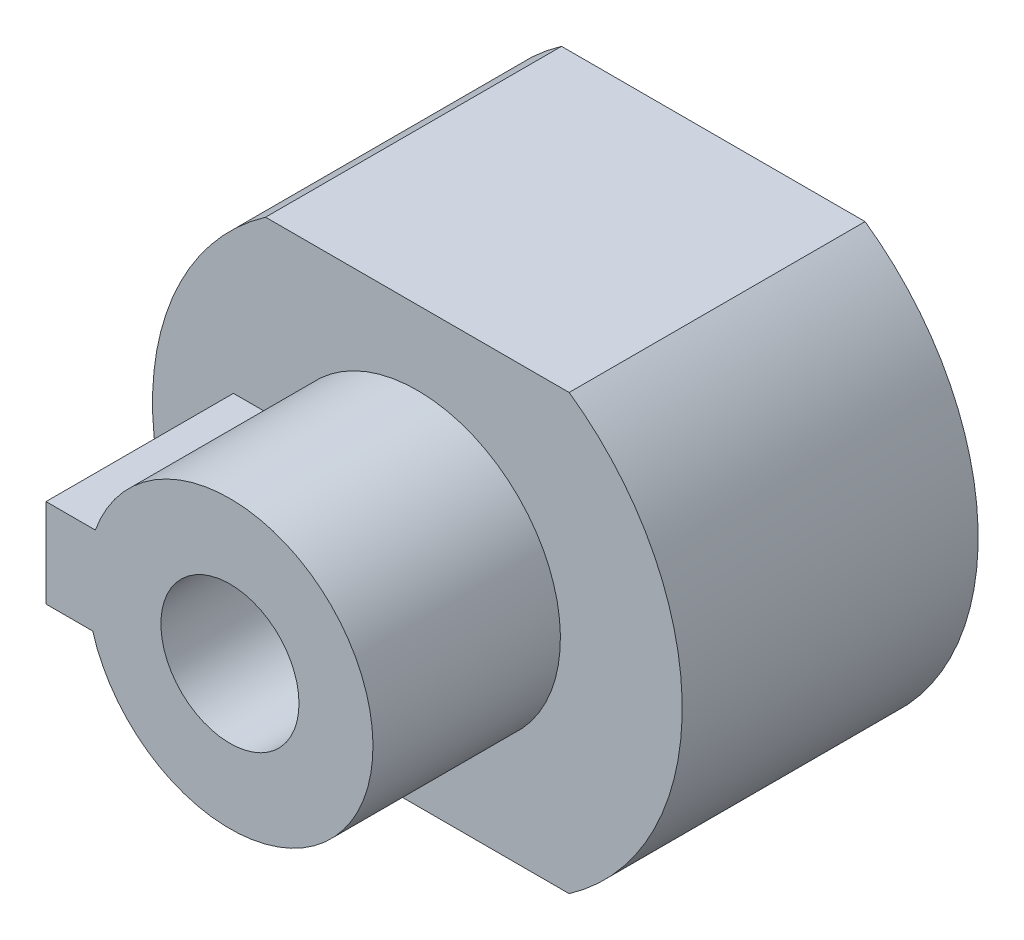
ISO-10303-21;
HEADER;
FILE_DESCRIPTION(('STEP AP214'),'2;1');
FILE_NAME('part.step','',(''),(''),'','','');
FILE_SCHEMA(('AUTOMOTIVE_DESIGN { 1 0 10303 214 1 1 1 1 }'));
ENDSEC;
DATA;
#1=APPLICATION_CONTEXT('core data for automotive mechanical design processes');
#2=APPLICATION_PROTOCOL_DEFINITION('international standard','automotive_design',2000,#1);
#3=PRODUCT_CONTEXT('',#1,'mechanical');
#4=PRODUCT('Part','Part','',(#3));
#5=PRODUCT_RELATED_PRODUCT_CATEGORY('part','',(#4));
#6=PRODUCT_DEFINITION_FORMATION('','',#4);
#7=PRODUCT_DEFINITION_CONTEXT('part definition',#1,'design');
#8=PRODUCT_DEFINITION('design','',#6,#7);
#9=PRODUCT_DEFINITION_SHAPE('','',#8);
#10=(LENGTH_UNIT() NAMED_UNIT(*) SI_UNIT(.MILLI.,.METRE.));
#11=(NAMED_UNIT(*) PLANE_ANGLE_UNIT() SI_UNIT($,.RADIAN.));
#12=(NAMED_UNIT(*) SI_UNIT($,.STERADIAN.) SOLID_ANGLE_UNIT());
#13=UNCERTAINTY_MEASURE_WITH_UNIT(LENGTH_MEASURE(1.E-05),#10,'distance_accuracy_value','');
#14=(GEOMETRIC_REPRESENTATION_CONTEXT(3) GLOBAL_UNCERTAINTY_ASSIGNED_CONTEXT((#13)) GLOBAL_UNIT_ASSIGNED_CONTEXT((#10,
#11,#12)) REPRESENTATION_CONTEXT('',''));
#15=CARTESIAN_POINT('',(0.,0.,0.));
#16=DIRECTION('',(0.,0.,1.));
#17=DIRECTION('',(1.,0.,0.));
#18=AXIS2_PLACEMENT_3D('',#15,#16,#17);
#19=CARTESIAN_POINT('',(0.,0.,6.));
#20=DIRECTION('',(0.,0.,1.));
#21=DIRECTION('',(1.,0.,0.));
#22=AXIS2_PLACEMENT_3D('',#19,#20,#21);
#23=PLANE('',#22);
#24=DIRECTION('',(-1.,0.,0.));
#25=VECTOR('',#24,1.);
#26=CARTESIAN_POINT('',(0.,-4.4,6.));
#27=LINE('',#26,#25);
#28=CARTESIAN_POINT('',(3.07711987667097,-4.4,6.));
#29=VERTEX_POINT('',#28);
#30=CARTESIAN_POINT('',(-3.07711987667097,-4.4,6.));
#31=VERTEX_POINT('',#30);
#32=EDGE_CURVE('E137',#29,#31,#27,.T.);
#33=ORIENTED_EDGE('',*,*,#32,.F.);
#34=CARTESIAN_POINT('',(0.,0.,6.));
#35=DIRECTION('',(0.,0.,1.));
#36=DIRECTION('',(1.,0.,0.));
#37=AXIS2_PLACEMENT_3D('',#34,#35,#36);
#38=CIRCLE('',#37,5.36923334708071);
#39=CARTESIAN_POINT('',(3.07711987667097,4.4,6.));
#40=VERTEX_POINT('',#39);
#41=EDGE_CURVE('E132',#29,#40,#38,.T.);
#42=ORIENTED_EDGE('',*,*,#41,.T.);
#43=DIRECTION('',(-1.,0.,0.));
#44=VECTOR('',#43,1.);
#45=CARTESIAN_POINT('',(0.,4.4,6.));
#46=LINE('',#45,#44);
#47=CARTESIAN_POINT('',(-3.07711987667097,4.4,6.));
#48=VERTEX_POINT('',#47);
#49=EDGE_CURVE('E121',#40,#48,#46,.T.);
#50=ORIENTED_EDGE('',*,*,#49,.T.);
#51=CARTESIAN_POINT('',(0.,0.,6.));
#52=DIRECTION('',(0.,0.,1.));
#53=DIRECTION('',(1.,0.,0.));
#54=AXIS2_PLACEMENT_3D('',#51,#52,#53);
#55=CIRCLE('',#54,5.36923334708071);
#56=EDGE_CURVE('E131',#31,#48,#55,.F.);
#57=ORIENTED_EDGE('',*,*,#56,.F.);
#58=EDGE_LOOP('',(#33,#42,#50,#57));
#59=FACE_BOUND('',#58,.T.);
#60=DIRECTION('',(-1.,0.,0.));
#61=VECTOR('',#60,1.);
#62=CARTESIAN_POINT('',(-3.72887210727574,0.981456581888599,6.));
#63=LINE('',#62,#61);
#64=CARTESIAN_POINT('',(-2.72887210727574,0.981456581888599,6.));
#65=VERTEX_POINT('',#64);
#66=CARTESIAN_POINT('',(-3.72887210727574,0.981456581888599,6.));
#67=VERTEX_POINT('',#66);
#68=EDGE_CURVE('E233',#65,#67,#63,.T.);
#69=ORIENTED_EDGE('',*,*,#68,.F.);
#70=CARTESIAN_POINT('',(0.,0.,6.));
#71=DIRECTION('',(0.,0.,1.));
#72=DIRECTION('',(1.,0.,0.));
#73=AXIS2_PLACEMENT_3D('',#70,#71,#72);
#74=CIRCLE('',#73,2.9);
#75=CARTESIAN_POINT('',(-2.78208315344213,-0.818543418111403,6.));
#76=VERTEX_POINT('',#75);
#77=EDGE_CURVE('E237',#76,#65,#74,.T.);
#78=ORIENTED_EDGE('',*,*,#77,.F.);
#79=DIRECTION('',(1.,0.,0.));
#80=VECTOR('',#79,1.);
#81=CARTESIAN_POINT('',(-3.72887210727574,-0.818543418111403,6.));
#82=LINE('',#81,#80);
#83=CARTESIAN_POINT('',(-3.72887210727574,-0.818543418111403,6.));
#84=VERTEX_POINT('',#83);
#85=EDGE_CURVE('E226',#84,#76,#82,.T.);
#86=ORIENTED_EDGE('',*,*,#85,.F.);
#87=DIRECTION('',(0.,-1.,0.));
#88=VECTOR('',#87,1.);
#89=CARTESIAN_POINT('',(-3.72887210727574,-0.818543418111403,6.));
#90=LINE('',#89,#88);
#91=EDGE_CURVE('E230',#67,#84,#90,.T.);
#92=ORIENTED_EDGE('',*,*,#91,.F.);
#93=EDGE_LOOP('',(#69,#78,#86,#92));
#94=FACE_BOUND('',#93,.T.);
#95=ADVANCED_FACE('F45',(#59,#94),#23,.T.);
#96=CARTESIAN_POINT('',(0.,-4.4,6.));
#97=DIRECTION('',(0.,-1.,0.));
#98=DIRECTION('',(0.,0.,-1.));
#99=AXIS2_PLACEMENT_3D('',#96,#97,#98);
#100=PLANE('',#99);
#101=DIRECTION('',(-1.,0.,0.));
#102=VECTOR('',#101,1.);
#103=CARTESIAN_POINT('',(0.,-4.4,0.));
#104=LINE('',#103,#102);
#105=CARTESIAN_POINT('',(3.07711987667097,-4.4,0.));
#106=VERTEX_POINT('',#105);
#107=CARTESIAN_POINT('',(-3.07711987667097,-4.4,0.));
#108=VERTEX_POINT('',#107);
#109=EDGE_CURVE('E177',#106,#108,#104,.T.);
#110=ORIENTED_EDGE('',*,*,#109,.F.);
#111=DIRECTION('',(0.,0.,-1.));
#112=VECTOR('',#111,1.);
#113=CARTESIAN_POINT('',(3.07711987667097,-4.4,6.));
#114=LINE('',#113,#112);
#115=EDGE_CURVE('E11',#29,#106,#114,.T.);
#116=ORIENTED_EDGE('',*,*,#115,.F.);
#117=ORIENTED_EDGE('',*,*,#32,.T.);
#118=DIRECTION('',(0.,0.,-1.));
#119=VECTOR('',#118,1.);
#120=CARTESIAN_POINT('',(-3.07711987667097,-4.4,6.));
#121=LINE('',#120,#119);
#122=EDGE_CURVE('E72',#31,#108,#121,.T.);
#123=ORIENTED_EDGE('',*,*,#122,.T.);
#124=EDGE_LOOP('',(#110,#116,#117,#123));
#125=FACE_BOUND('',#124,.T.);
#126=ADVANCED_FACE('F276',(#125),#100,.T.);
#127=CARTESIAN_POINT('',(0.,0.,6.));
#128=DIRECTION('',(0.,0.,-1.));
#129=DIRECTION('',(-1.,0.,0.));
#130=AXIS2_PLACEMENT_3D('',#127,#128,#129);
#131=CYLINDRICAL_SURFACE('',#130,5.36923334708071);
#132=CARTESIAN_POINT('',(0.,0.,0.));
#133=DIRECTION('',(0.,0.,1.));
#134=DIRECTION('',(1.,0.,0.));
#135=AXIS2_PLACEMENT_3D('',#132,#133,#134);
#136=CIRCLE('',#135,5.36923334708071);
#137=CARTESIAN_POINT('',(3.07711987667097,4.4,0.));
#138=VERTEX_POINT('',#137);
#139=EDGE_CURVE('E143',#106,#138,#136,.T.);
#140=ORIENTED_EDGE('',*,*,#139,.T.);
#141=DIRECTION('',(0.,0.,-1.));
#142=VECTOR('',#141,1.);
#143=CARTESIAN_POINT('',(3.07711987667097,4.4,6.));
#144=LINE('',#143,#142);
#145=EDGE_CURVE('E55',#40,#138,#144,.T.);
#146=ORIENTED_EDGE('',*,*,#145,.F.);
#147=ORIENTED_EDGE('',*,*,#41,.F.);
#148=ORIENTED_EDGE('',*,*,#115,.T.);
#149=EDGE_LOOP('',(#140,#146,#147,#148));
#150=FACE_BOUND('',#149,.T.);
#151=ADVANCED_FACE('F141',(#150),#131,.T.);
#152=CARTESIAN_POINT('',(0.,4.4,6.));
#153=DIRECTION('',(0.,-1.,0.));
#154=DIRECTION('',(0.,0.,-1.));
#155=AXIS2_PLACEMENT_3D('',#152,#153,#154);
#156=PLANE('',#155);
#157=DIRECTION('',(-1.,0.,0.));
#158=VECTOR('',#157,1.);
#159=CARTESIAN_POINT('',(0.,4.4,0.));
#160=LINE('',#159,#158);
#161=CARTESIAN_POINT('',(-3.07711987667097,4.4,0.));
#162=VERTEX_POINT('',#161);
#163=EDGE_CURVE('E172',#138,#162,#160,.T.);
#164=ORIENTED_EDGE('',*,*,#163,.T.);
#165=DIRECTION('',(0.,0.,-1.));
#166=VECTOR('',#165,1.);
#167=CARTESIAN_POINT('',(-3.07711987667097,4.4,6.));
#168=LINE('',#167,#166);
#169=EDGE_CURVE('E127',#48,#162,#168,.T.);
#170=ORIENTED_EDGE('',*,*,#169,.F.);
#171=ORIENTED_EDGE('',*,*,#49,.F.);
#172=ORIENTED_EDGE('',*,*,#145,.T.);
#173=EDGE_LOOP('',(#164,#170,#171,#172));
#174=FACE_BOUND('',#173,.T.);
#175=ADVANCED_FACE('F124',(#174),#156,.F.);
#176=CARTESIAN_POINT('',(0.,0.,6.));
#177=DIRECTION('',(0.,0.,-1.));
#178=DIRECTION('',(-1.,0.,0.));
#179=AXIS2_PLACEMENT_3D('',#176,#177,#178);
#180=CYLINDRICAL_SURFACE('',#179,2.86923334708071);
#181=CARTESIAN_POINT('',(0.,0.,0.));
#182=DIRECTION('',(0.,0.,1.));
#183=DIRECTION('',(1.,0.,0.));
#184=AXIS2_PLACEMENT_3D('',#181,#182,#183);
#185=CIRCLE('',#184,2.86923334708071);
#186=CARTESIAN_POINT('',(2.15,-1.9,0.));
#187=VERTEX_POINT('',#186);
#188=CARTESIAN_POINT('',(2.15,1.9,0.));
#189=VERTEX_POINT('',#188);
#190=EDGE_CURVE('E191',#187,#189,#185,.T.);
#191=ORIENTED_EDGE('',*,*,#190,.F.);
#192=DIRECTION('',(0.,0.,-1.));
#193=VECTOR('',#192,1.);
#194=CARTESIAN_POINT('',(2.15,-1.9,6.));
#195=LINE('',#194,#193);
#196=CARTESIAN_POINT('',(2.15,-1.9,6.));
#197=VERTEX_POINT('',#196);
#198=EDGE_CURVE('E159',#197,#187,#195,.T.);
#199=ORIENTED_EDGE('',*,*,#198,.F.);
#200=CARTESIAN_POINT('',(0.,0.,6.));
#201=DIRECTION('',(0.,0.,1.));
#202=DIRECTION('',(1.,0.,0.));
#203=AXIS2_PLACEMENT_3D('',#200,#201,#202);
#204=CIRCLE('',#203,2.86923334708071);
#205=CARTESIAN_POINT('',(2.15,1.9,6.));
#206=VERTEX_POINT('',#205);
#207=EDGE_CURVE('E171',#197,#206,#204,.T.);
#208=ORIENTED_EDGE('',*,*,#207,.T.);
#209=DIRECTION('',(0.,0.,-1.));
#210=VECTOR('',#209,1.);
#211=CARTESIAN_POINT('',(2.15,1.9,6.));
#212=LINE('',#211,#210);
#213=EDGE_CURVE('E150',#206,#189,#212,.T.);
#214=ORIENTED_EDGE('',*,*,#213,.T.);
#215=EDGE_LOOP('',(#191,#199,#208,#214));
#216=FACE_BOUND('',#215,.T.);
#217=ADVANCED_FACE('F47',(#216),#180,.F.);
#218=CARTESIAN_POINT('',(0.,-1.9,6.));
#219=DIRECTION('',(0.,-1.,0.));
#220=DIRECTION('',(0.,0.,-1.));
#221=AXIS2_PLACEMENT_3D('',#218,#219,#220);
#222=PLANE('',#221);
#223=DIRECTION('',(-1.,0.,0.));
#224=VECTOR('',#223,1.);
#225=CARTESIAN_POINT('',(0.,-1.9,0.));
#226=LINE('',#225,#224);
#227=CARTESIAN_POINT('',(-2.15,-1.9,0.));
#228=VERTEX_POINT('',#227);
#229=EDGE_CURVE('E188',#187,#228,#226,.T.);
#230=ORIENTED_EDGE('',*,*,#229,.T.);
#231=DIRECTION('',(0.,0.,-1.));
#232=VECTOR('',#231,1.);
#233=CARTESIAN_POINT('',(-2.15,-1.9,6.));
#234=LINE('',#233,#232);
#235=CARTESIAN_POINT('',(-2.15,-1.9,6.));
#236=VERTEX_POINT('',#235);
#237=EDGE_CURVE('E156',#236,#228,#234,.T.);
#238=ORIENTED_EDGE('',*,*,#237,.F.);
#239=DIRECTION('',(-1.,0.,0.));
#240=VECTOR('',#239,1.);
#241=CARTESIAN_POINT('',(0.,-1.9,6.));
#242=LINE('',#241,#240);
#243=EDGE_CURVE('E206',#197,#236,#242,.T.);
#244=ORIENTED_EDGE('',*,*,#243,.F.);
#245=ORIENTED_EDGE('',*,*,#198,.T.);
#246=EDGE_LOOP('',(#230,#238,#244,#245));
#247=FACE_BOUND('',#246,.T.);
#248=ADVANCED_FACE('F304',(#247),#222,.F.);
#249=CARTESIAN_POINT('',(0.,0.,6.));
#250=DIRECTION('',(0.,0.,-1.));
#251=DIRECTION('',(-1.,0.,0.));
#252=AXIS2_PLACEMENT_3D('',#249,#250,#251);
#253=CYLINDRICAL_SURFACE('',#252,2.86923334708071);
#254=CARTESIAN_POINT('',(0.,0.,0.));
#255=DIRECTION('',(0.,0.,1.));
#256=DIRECTION('',(1.,0.,0.));
#257=AXIS2_PLACEMENT_3D('',#254,#255,#256);
#258=CIRCLE('',#257,2.86923334708071);
#259=CARTESIAN_POINT('',(-2.15,1.9,0.));
#260=VERTEX_POINT('',#259);
#261=EDGE_CURVE('E184',#228,#260,#258,.F.);
#262=ORIENTED_EDGE('',*,*,#261,.T.);
#263=DIRECTION('',(0.,0.,-1.));
#264=VECTOR('',#263,1.);
#265=CARTESIAN_POINT('',(-2.15,1.9,6.));
#266=LINE('',#265,#264);
#267=CARTESIAN_POINT('',(-2.15,1.9,6.));
#268=VERTEX_POINT('',#267);
#269=EDGE_CURVE('E153',#268,#260,#266,.T.);
#270=ORIENTED_EDGE('',*,*,#269,.F.);
#271=CARTESIAN_POINT('',(0.,0.,6.));
#272=DIRECTION('',(0.,0.,1.));
#273=DIRECTION('',(1.,0.,0.));
#274=AXIS2_PLACEMENT_3D('',#271,#272,#273);
#275=CIRCLE('',#274,2.86923334708071);
#276=EDGE_CURVE('E111',#236,#268,#275,.F.);
#277=ORIENTED_EDGE('',*,*,#276,.F.);
#278=ORIENTED_EDGE('',*,*,#237,.T.);
#279=EDGE_LOOP('',(#262,#270,#277,#278));
#280=FACE_BOUND('',#279,.T.);
#281=ADVANCED_FACE('F301',(#280),#253,.F.);
#282=CARTESIAN_POINT('',(0.,1.9,6.));
#283=DIRECTION('',(0.,-1.,0.));
#284=DIRECTION('',(0.,0.,-1.));
#285=AXIS2_PLACEMENT_3D('',#282,#283,#284);
#286=PLANE('',#285);
#287=DIRECTION('',(-1.,0.,0.));
#288=VECTOR('',#287,1.);
#289=CARTESIAN_POINT('',(0.,1.9,0.));
#290=LINE('',#289,#288);
#291=EDGE_CURVE('E180',#189,#260,#290,.T.);
#292=ORIENTED_EDGE('',*,*,#291,.F.);
#293=ORIENTED_EDGE('',*,*,#213,.F.);
#294=DIRECTION('',(-1.,0.,0.));
#295=VECTOR('',#294,1.);
#296=CARTESIAN_POINT('',(0.,1.9,6.));
#297=LINE('',#296,#295);
#298=EDGE_CURVE('E200',#206,#268,#297,.T.);
#299=ORIENTED_EDGE('',*,*,#298,.T.);
#300=ORIENTED_EDGE('',*,*,#269,.T.);
#301=EDGE_LOOP('',(#292,#293,#299,#300));
#302=FACE_BOUND('',#301,.T.);
#303=ADVANCED_FACE('F294',(#302),#286,.T.);
#304=CARTESIAN_POINT('',(0.,0.,6.));
#305=DIRECTION('',(0.,0.,-1.));
#306=DIRECTION('',(-1.,0.,0.));
#307=AXIS2_PLACEMENT_3D('',#304,#305,#306);
#308=CYLINDRICAL_SURFACE('',#307,5.36923334708071);
#309=CARTESIAN_POINT('',(0.,0.,0.));
#310=DIRECTION('',(0.,0.,1.));
#311=DIRECTION('',(1.,0.,0.));
#312=AXIS2_PLACEMENT_3D('',#309,#310,#311);
#313=CIRCLE('',#312,5.36923334708071);
#314=EDGE_CURVE('E167',#108,#162,#313,.F.);
#315=ORIENTED_EDGE('',*,*,#314,.F.);
#316=ORIENTED_EDGE('',*,*,#122,.F.);
#317=ORIENTED_EDGE('',*,*,#56,.T.);
#318=ORIENTED_EDGE('',*,*,#169,.T.);
#319=EDGE_LOOP('',(#315,#316,#317,#318));
#320=FACE_BOUND('',#319,.T.);
#321=ADVANCED_FACE('F290',(#320),#308,.T.);
#322=CARTESIAN_POINT('',(0.,0.,0.));
#323=DIRECTION('',(0.,0.,1.));
#324=DIRECTION('',(1.,0.,0.));
#325=AXIS2_PLACEMENT_3D('',#322,#323,#324);
#326=PLANE('',#325);
#327=ORIENTED_EDGE('',*,*,#190,.T.);
#328=ORIENTED_EDGE('',*,*,#291,.T.);
#329=ORIENTED_EDGE('',*,*,#261,.F.);
#330=ORIENTED_EDGE('',*,*,#229,.F.);
#331=EDGE_LOOP('',(#327,#328,#329,#330));
#332=FACE_BOUND('',#331,.T.);
#333=ORIENTED_EDGE('',*,*,#109,.T.);
#334=ORIENTED_EDGE('',*,*,#314,.T.);
#335=ORIENTED_EDGE('',*,*,#163,.F.);
#336=ORIENTED_EDGE('',*,*,#139,.F.);
#337=EDGE_LOOP('',(#333,#334,#335,#336));
#338=FACE_BOUND('',#337,.T.);
#339=ADVANCED_FACE('F287',(#332,#338),#326,.F.);
#340=CARTESIAN_POINT('',(0.,0.,9.8));
#341=DIRECTION('',(0.,0.,1.));
#342=DIRECTION('',(1.,0.,0.));
#343=AXIS2_PLACEMENT_3D('',#340,#341,#342);
#344=PLANE('',#343);
#345=CARTESIAN_POINT('',(0.,0.,9.8));
#346=DIRECTION('',(0.,0.,1.));
#347=DIRECTION('',(1.,0.,0.));
#348=AXIS2_PLACEMENT_3D('',#345,#346,#347);
#349=CIRCLE('',#348,1.4);
#350=CARTESIAN_POINT('',(1.4,0.,9.8));
#351=VERTEX_POINT('',#350);
#352=EDGE_CURVE('E255',#351,#351,#349,.T.);
#353=ORIENTED_EDGE('',*,*,#352,.F.);
#354=EDGE_LOOP('',(#353));
#355=FACE_BOUND('',#354,.T.);
#356=CARTESIAN_POINT('',(0.,0.,9.8));
#357=DIRECTION('',(0.,0.,1.));
#358=DIRECTION('',(1.,0.,0.));
#359=AXIS2_PLACEMENT_3D('',#356,#357,#358);
#360=CIRCLE('',#359,2.9);
#361=CARTESIAN_POINT('',(-2.78208315344213,-0.818543418111403,9.8));
#362=VERTEX_POINT('',#361);
#363=CARTESIAN_POINT('',(-2.72887210727574,0.981456581888599,9.8));
#364=VERTEX_POINT('',#363);
#365=EDGE_CURVE('E229',#362,#364,#360,.T.);
#366=ORIENTED_EDGE('',*,*,#365,.T.);
#367=DIRECTION('',(-1.,0.,0.));
#368=VECTOR('',#367,1.);
#369=CARTESIAN_POINT('',(-3.72887210727574,0.981456581888599,9.8));
#370=LINE('',#369,#368);
#371=CARTESIAN_POINT('',(-3.72887210727574,0.981456581888599,9.8));
#372=VERTEX_POINT('',#371);
#373=EDGE_CURVE('E248',#364,#372,#370,.T.);
#374=ORIENTED_EDGE('',*,*,#373,.T.);
#375=DIRECTION('',(0.,-1.,0.));
#376=VECTOR('',#375,1.);
#377=CARTESIAN_POINT('',(-3.72887210727574,-0.818543418111403,9.8));
#378=LINE('',#377,#376);
#379=CARTESIAN_POINT('',(-3.72887210727574,-0.818543418111403,9.8));
#380=VERTEX_POINT('',#379);
#381=EDGE_CURVE('E244',#372,#380,#378,.T.);
#382=ORIENTED_EDGE('',*,*,#381,.T.);
#383=DIRECTION('',(1.,0.,0.));
#384=VECTOR('',#383,1.);
#385=CARTESIAN_POINT('',(-3.72887210727574,-0.818543418111403,9.8));
#386=LINE('',#385,#384);
#387=EDGE_CURVE('E225',#380,#362,#386,.T.);
#388=ORIENTED_EDGE('',*,*,#387,.T.);
#389=EDGE_LOOP('',(#366,#374,#382,#388));
#390=FACE_BOUND('',#389,.T.);
#391=ADVANCED_FACE('F289',(#355,#390),#344,.T.);
#392=CARTESIAN_POINT('',(-3.72887210727574,-0.818543418111403,9.8));
#393=DIRECTION('',(0.,1.,0.));
#394=DIRECTION('',(-1.,0.,0.));
#395=AXIS2_PLACEMENT_3D('',#392,#393,#394);
#396=PLANE('',#395);
#397=ORIENTED_EDGE('',*,*,#85,.T.);
#398=DIRECTION('',(0.,0.,-1.));
#399=VECTOR('',#398,1.);
#400=CARTESIAN_POINT('',(-2.78208315344213,-0.818543418111403,9.8));
#401=LINE('',#400,#399);
#402=EDGE_CURVE('E221',#362,#76,#401,.T.);
#403=ORIENTED_EDGE('',*,*,#402,.F.);
#404=ORIENTED_EDGE('',*,*,#387,.F.);
#405=DIRECTION('',(0.,0.,-1.));
#406=VECTOR('',#405,1.);
#407=CARTESIAN_POINT('',(-3.72887210727574,-0.818543418111403,9.8));
#408=LINE('',#407,#406);
#409=EDGE_CURVE('E63',#380,#84,#408,.T.);
#410=ORIENTED_EDGE('',*,*,#409,.T.);
#411=EDGE_LOOP('',(#397,#403,#404,#410));
#412=FACE_BOUND('',#411,.T.);
#413=ADVANCED_FACE('F350',(#412),#396,.F.);
#414=CARTESIAN_POINT('',(-3.72887210727574,-0.818543418111403,9.8));
#415=DIRECTION('',(1.,0.,0.));
#416=DIRECTION('',(0.,0.,-1.));
#417=AXIS2_PLACEMENT_3D('',#414,#415,#416);
#418=PLANE('',#417);
#419=ORIENTED_EDGE('',*,*,#91,.T.);
#420=ORIENTED_EDGE('',*,*,#409,.F.);
#421=ORIENTED_EDGE('',*,*,#381,.F.);
#422=DIRECTION('',(0.,0.,-1.));
#423=VECTOR('',#422,1.);
#424=CARTESIAN_POINT('',(-3.72887210727574,0.981456581888599,9.8));
#425=LINE('',#424,#423);
#426=EDGE_CURVE('E215',#372,#67,#425,.T.);
#427=ORIENTED_EDGE('',*,*,#426,.T.);
#428=EDGE_LOOP('',(#419,#420,#421,#427));
#429=FACE_BOUND('',#428,.T.);
#430=ADVANCED_FACE('F349',(#429),#418,.F.);
#431=CARTESIAN_POINT('',(-3.72887210727574,0.981456581888599,9.8));
#432=DIRECTION('',(0.,-1.,0.));
#433=DIRECTION('',(1.,0.,0.));
#434=AXIS2_PLACEMENT_3D('',#431,#432,#433);
#435=PLANE('',#434);
#436=ORIENTED_EDGE('',*,*,#68,.T.);
#437=ORIENTED_EDGE('',*,*,#426,.F.);
#438=ORIENTED_EDGE('',*,*,#373,.F.);
#439=DIRECTION('',(0.,0.,-1.));
#440=VECTOR('',#439,1.);
#441=CARTESIAN_POINT('',(-2.72887210727574,0.981456581888599,9.8));
#442=LINE('',#441,#440);
#443=EDGE_CURVE('E195',#364,#65,#442,.T.);
#444=ORIENTED_EDGE('',*,*,#443,.T.);
#445=EDGE_LOOP('',(#436,#437,#438,#444));
#446=FACE_BOUND('',#445,.T.);
#447=ADVANCED_FACE('F337',(#446),#435,.F.);
#448=CARTESIAN_POINT('',(0.,0.,9.8));
#449=DIRECTION('',(0.,0.,-1.));
#450=DIRECTION('',(-1.,0.,0.));
#451=AXIS2_PLACEMENT_3D('',#448,#449,#450);
#452=CYLINDRICAL_SURFACE('',#451,2.9);
#453=ORIENTED_EDGE('',*,*,#77,.T.);
#454=ORIENTED_EDGE('',*,*,#443,.F.);
#455=ORIENTED_EDGE('',*,*,#365,.F.);
#456=ORIENTED_EDGE('',*,*,#402,.T.);
#457=EDGE_LOOP('',(#453,#454,#455,#456));
#458=FACE_BOUND('',#457,.T.);
#459=ADVANCED_FACE('F272',(#458),#452,.T.);
#460=CARTESIAN_POINT('',(0.,0.,6.));
#461=DIRECTION('',(0.,0.,1.));
#462=DIRECTION('',(1.,0.,0.));
#463=AXIS2_PLACEMENT_3D('',#460,#461,#462);
#464=PLANE('',#463);
#465=CARTESIAN_POINT('',(0.,0.,6.));
#466=DIRECTION('',(0.,0.,1.));
#467=DIRECTION('',(1.,0.,0.));
#468=AXIS2_PLACEMENT_3D('',#465,#466,#467);
#469=CIRCLE('',#468,1.4);
#470=CARTESIAN_POINT('',(1.4,0.,6.));
#471=VERTEX_POINT('',#470);
#472=EDGE_CURVE('E49',#471,#471,#469,.T.);
#473=ORIENTED_EDGE('',*,*,#472,.T.);
#474=EDGE_LOOP('',(#473));
#475=FACE_BOUND('',#474,.T.);
#476=ORIENTED_EDGE('',*,*,#207,.F.);
#477=ORIENTED_EDGE('',*,*,#243,.T.);
#478=ORIENTED_EDGE('',*,*,#276,.T.);
#479=ORIENTED_EDGE('',*,*,#298,.F.);
#480=EDGE_LOOP('',(#476,#477,#478,#479));
#481=FACE_BOUND('',#480,.T.);
#482=ADVANCED_FACE('F264',(#475,#481),#464,.F.);
#483=CARTESIAN_POINT('',(0.,0.,0.));
#484=DIRECTION('',(0.,0.,1.));
#485=DIRECTION('',(1.,0.,0.));
#486=AXIS2_PLACEMENT_3D('',#483,#484,#485);
#487=CYLINDRICAL_SURFACE('',#486,1.4);
#488=ORIENTED_EDGE('',*,*,#352,.T.);
#489=EDGE_LOOP('',(#488));
#490=FACE_BOUND('',#489,.T.);
#491=ORIENTED_EDGE('',*,*,#472,.F.);
#492=EDGE_LOOP('',(#491));
#493=FACE_BOUND('',#492,.T.);
#494=ADVANCED_FACE('F266',(#490,#493),#487,.F.);
#495=CLOSED_SHELL('',(#95,#126,#151,#175,#217,#248,#281,#303,#321,#339,#391,#413,#430,#447,#459,
#482,#494));
#496=MANIFOLD_SOLID_BREP('B2',#495);
#497=ADVANCED_BREP_SHAPE_REPRESENTATION('',(#18,#496),#14);
#498=SHAPE_DEFINITION_REPRESENTATION(#9,#497);
ENDSEC;
END-ISO-10303-21;
